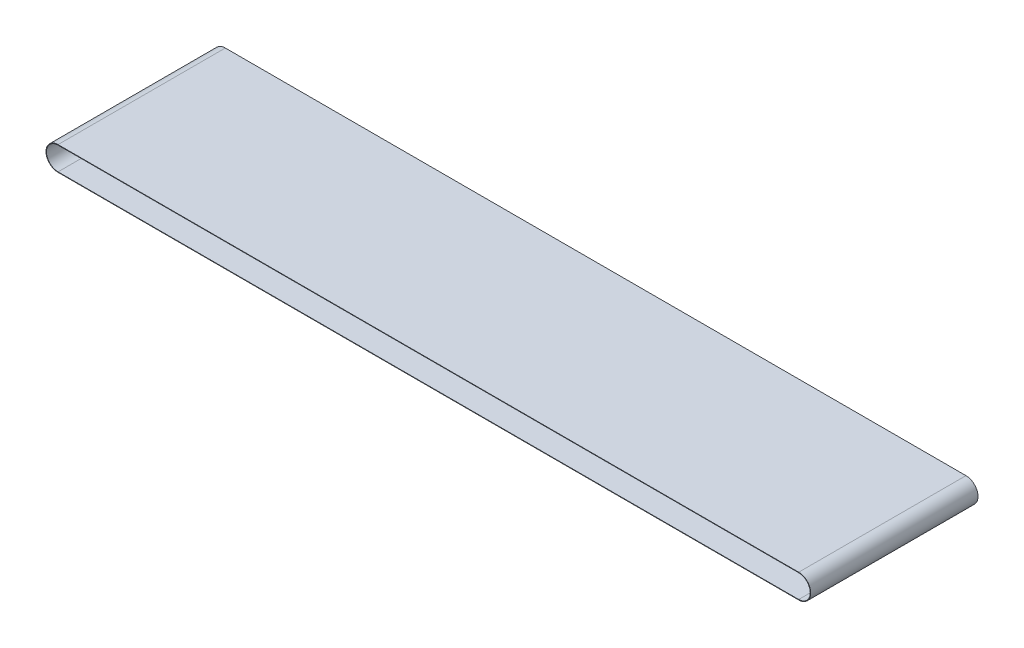
ISO-10303-21;
HEADER;
FILE_DESCRIPTION(('STEP AP214'),'2;1');
FILE_NAME('part.step','',(''),(''),'','','');
FILE_SCHEMA(('AUTOMOTIVE_DESIGN { 1 0 10303 214 1 1 1 1 }'));
ENDSEC;
DATA;
#1=APPLICATION_CONTEXT('core data for automotive mechanical design processes');
#2=APPLICATION_PROTOCOL_DEFINITION('international standard','automotive_design',2000,#1);
#3=PRODUCT_CONTEXT('',#1,'mechanical');
#4=PRODUCT('Part','Part','',(#3));
#5=PRODUCT_RELATED_PRODUCT_CATEGORY('part','',(#4));
#6=PRODUCT_DEFINITION_FORMATION('','',#4);
#7=PRODUCT_DEFINITION_CONTEXT('part definition',#1,'design');
#8=PRODUCT_DEFINITION('design','',#6,#7);
#9=PRODUCT_DEFINITION_SHAPE('','',#8);
#10=(LENGTH_UNIT() NAMED_UNIT(*) SI_UNIT(.MILLI.,.METRE.));
#11=(NAMED_UNIT(*) PLANE_ANGLE_UNIT() SI_UNIT($,.RADIAN.));
#12=(NAMED_UNIT(*) SI_UNIT($,.STERADIAN.) SOLID_ANGLE_UNIT());
#13=UNCERTAINTY_MEASURE_WITH_UNIT(LENGTH_MEASURE(1.E-05),#10,'distance_accuracy_value','');
#14=(GEOMETRIC_REPRESENTATION_CONTEXT(3) GLOBAL_UNCERTAINTY_ASSIGNED_CONTEXT((#13)) GLOBAL_UNIT_ASSIGNED_CONTEXT((#10,
#11,#12)) REPRESENTATION_CONTEXT('',''));
#15=CARTESIAN_POINT('',(0.,0.,0.));
#16=DIRECTION('',(0.,0.,1.));
#17=DIRECTION('',(1.,0.,0.));
#18=AXIS2_PLACEMENT_3D('',#15,#16,#17);
#19=CARTESIAN_POINT('',(0.,0.,1084.));
#20=DIRECTION('',(0.,0.,1.));
#21=DIRECTION('',(1.,0.,0.));
#22=AXIS2_PLACEMENT_3D('',#19,#20,#21);
#23=PLANE('',#22);
#24=CARTESIAN_POINT('',(0.,0.,1084.));
#25=DIRECTION('',(0.,0.,1.));
#26=DIRECTION('',(1.,0.,0.));
#27=AXIS2_PLACEMENT_3D('',#24,#25,#26);
#28=CIRCLE('',#27,78.);
#29=CARTESIAN_POINT('',(0.,78.,1084.));
#30=VERTEX_POINT('',#29);
#31=CARTESIAN_POINT('',(0.,-78.,1084.));
#32=VERTEX_POINT('',#31);
#33=EDGE_CURVE('E162',#30,#32,#28,.T.);
#34=ORIENTED_EDGE('',*,*,#33,.T.);
#35=DIRECTION('',(1.,0.,0.));
#36=VECTOR('',#35,1.);
#37=CARTESIAN_POINT('',(0.,-78.,1084.));
#38=LINE('',#37,#36);
#39=CARTESIAN_POINT('',(4800.,-78.,1084.));
#40=VERTEX_POINT('',#39);
#41=EDGE_CURVE('E167',#32,#40,#38,.T.);
#42=ORIENTED_EDGE('',*,*,#41,.T.);
#43=CARTESIAN_POINT('',(4800.,0.,1084.));
#44=DIRECTION('',(0.,0.,1.));
#45=DIRECTION('',(1.,0.,0.));
#46=AXIS2_PLACEMENT_3D('',#43,#44,#45);
#47=CIRCLE('',#46,78.);
#48=CARTESIAN_POINT('',(4800.,78.,1084.));
#49=VERTEX_POINT('',#48);
#50=EDGE_CURVE('E169',#40,#49,#47,.T.);
#51=ORIENTED_EDGE('',*,*,#50,.T.);
#52=DIRECTION('',(-1.,0.,0.));
#53=VECTOR('',#52,1.);
#54=CARTESIAN_POINT('',(0.,78.,1084.));
#55=LINE('',#54,#53);
#56=EDGE_CURVE('E175',#49,#30,#55,.T.);
#57=ORIENTED_EDGE('',*,*,#56,.T.);
#58=EDGE_LOOP('',(#34,#42,#51,#57));
#59=FACE_BOUND('',#58,.T.);
#60=DIRECTION('',(1.,0.,0.));
#61=VECTOR('',#60,1.);
#62=CARTESIAN_POINT('',(0.,-75.,1084.));
#63=LINE('',#62,#61);
#64=CARTESIAN_POINT('',(0.,-75.,1084.));
#65=VERTEX_POINT('',#64);
#66=CARTESIAN_POINT('',(4800.,-75.,1084.));
#67=VERTEX_POINT('',#66);
#68=EDGE_CURVE('E136',#65,#67,#63,.T.);
#69=ORIENTED_EDGE('',*,*,#68,.F.);
#70=CARTESIAN_POINT('',(0.,0.,1084.));
#71=DIRECTION('',(0.,0.,1.));
#72=DIRECTION('',(1.,0.,0.));
#73=AXIS2_PLACEMENT_3D('',#70,#71,#72);
#74=CIRCLE('',#73,75.);
#75=CARTESIAN_POINT('',(0.,75.,1084.));
#76=VERTEX_POINT('',#75);
#77=EDGE_CURVE('E126',#76,#65,#74,.T.);
#78=ORIENTED_EDGE('',*,*,#77,.F.);
#79=DIRECTION('',(-1.,0.,0.));
#80=VECTOR('',#79,1.);
#81=CARTESIAN_POINT('',(0.,75.,1084.));
#82=LINE('',#81,#80);
#83=CARTESIAN_POINT('',(4800.,75.,1084.));
#84=VERTEX_POINT('',#83);
#85=EDGE_CURVE('E148',#84,#76,#82,.T.);
#86=ORIENTED_EDGE('',*,*,#85,.F.);
#87=CARTESIAN_POINT('',(4800.,0.,1084.));
#88=DIRECTION('',(0.,0.,1.));
#89=DIRECTION('',(1.,0.,0.));
#90=AXIS2_PLACEMENT_3D('',#87,#88,#89);
#91=CIRCLE('',#90,75.);
#92=EDGE_CURVE('E149',#67,#84,#91,.T.);
#93=ORIENTED_EDGE('',*,*,#92,.F.);
#94=EDGE_LOOP('',(#69,#78,#86,#93));
#95=FACE_BOUND('',#94,.T.);
#96=ADVANCED_FACE('F61',(#59,#95),#23,.T.);
#97=CARTESIAN_POINT('',(0.,0.,0.));
#98=DIRECTION('',(0.,0.,1.));
#99=DIRECTION('',(1.,0.,0.));
#100=AXIS2_PLACEMENT_3D('',#97,#98,#99);
#101=PLANE('',#100);
#102=CARTESIAN_POINT('',(0.,0.,0.));
#103=DIRECTION('',(0.,0.,1.));
#104=DIRECTION('',(1.,0.,0.));
#105=AXIS2_PLACEMENT_3D('',#102,#103,#104);
#106=CIRCLE('',#105,78.);
#107=CARTESIAN_POINT('',(0.,78.,0.));
#108=VERTEX_POINT('',#107);
#109=CARTESIAN_POINT('',(0.,-78.,0.));
#110=VERTEX_POINT('',#109);
#111=EDGE_CURVE('E143',#108,#110,#106,.T.);
#112=ORIENTED_EDGE('',*,*,#111,.F.);
#113=DIRECTION('',(-1.,0.,0.));
#114=VECTOR('',#113,1.);
#115=CARTESIAN_POINT('',(0.,78.,0.));
#116=LINE('',#115,#114);
#117=CARTESIAN_POINT('',(4800.,78.,0.));
#118=VERTEX_POINT('',#117);
#119=EDGE_CURVE('E166',#118,#108,#116,.T.);
#120=ORIENTED_EDGE('',*,*,#119,.F.);
#121=CARTESIAN_POINT('',(4800.,0.,0.));
#122=DIRECTION('',(0.,0.,1.));
#123=DIRECTION('',(1.,0.,0.));
#124=AXIS2_PLACEMENT_3D('',#121,#122,#123);
#125=CIRCLE('',#124,78.);
#126=CARTESIAN_POINT('',(4800.,-78.,0.));
#127=VERTEX_POINT('',#126);
#128=EDGE_CURVE('E177',#127,#118,#125,.T.);
#129=ORIENTED_EDGE('',*,*,#128,.F.);
#130=DIRECTION('',(1.,0.,0.));
#131=VECTOR('',#130,1.);
#132=CARTESIAN_POINT('',(0.,-78.,0.));
#133=LINE('',#132,#131);
#134=EDGE_CURVE('E180',#110,#127,#133,.T.);
#135=ORIENTED_EDGE('',*,*,#134,.F.);
#136=EDGE_LOOP('',(#112,#120,#129,#135));
#137=FACE_BOUND('',#136,.T.);
#138=CARTESIAN_POINT('',(0.,0.,0.));
#139=DIRECTION('',(0.,0.,1.));
#140=DIRECTION('',(1.,0.,0.));
#141=AXIS2_PLACEMENT_3D('',#138,#139,#140);
#142=CIRCLE('',#141,75.);
#143=CARTESIAN_POINT('',(0.,75.,0.));
#144=VERTEX_POINT('',#143);
#145=CARTESIAN_POINT('',(0.,-75.,0.));
#146=VERTEX_POINT('',#145);
#147=EDGE_CURVE('E86',#144,#146,#142,.T.);
#148=ORIENTED_EDGE('',*,*,#147,.T.);
#149=DIRECTION('',(1.,0.,0.));
#150=VECTOR('',#149,1.);
#151=CARTESIAN_POINT('',(0.,-75.,0.));
#152=LINE('',#151,#150);
#153=CARTESIAN_POINT('',(4800.,-75.,0.));
#154=VERTEX_POINT('',#153);
#155=EDGE_CURVE('E142',#146,#154,#152,.T.);
#156=ORIENTED_EDGE('',*,*,#155,.T.);
#157=CARTESIAN_POINT('',(4800.,0.,0.));
#158=DIRECTION('',(0.,0.,1.));
#159=DIRECTION('',(1.,0.,0.));
#160=AXIS2_PLACEMENT_3D('',#157,#158,#159);
#161=CIRCLE('',#160,75.);
#162=CARTESIAN_POINT('',(4800.,75.,0.));
#163=VERTEX_POINT('',#162);
#164=EDGE_CURVE('E157',#154,#163,#161,.T.);
#165=ORIENTED_EDGE('',*,*,#164,.T.);
#166=DIRECTION('',(-1.,0.,0.));
#167=VECTOR('',#166,1.);
#168=CARTESIAN_POINT('',(0.,75.,0.));
#169=LINE('',#168,#167);
#170=EDGE_CURVE('E140',#163,#144,#169,.T.);
#171=ORIENTED_EDGE('',*,*,#170,.T.);
#172=EDGE_LOOP('',(#148,#156,#165,#171));
#173=FACE_BOUND('',#172,.T.);
#174=ADVANCED_FACE('F200',(#137,#173),#101,.F.);
#175=CARTESIAN_POINT('',(0.,0.,1084.));
#176=DIRECTION('',(0.,0.,-1.));
#177=DIRECTION('',(-1.,0.,0.));
#178=AXIS2_PLACEMENT_3D('',#175,#176,#177);
#179=CYLINDRICAL_SURFACE('',#178,78.);
#180=ORIENTED_EDGE('',*,*,#111,.T.);
#181=DIRECTION('',(0.,0.,-1.));
#182=VECTOR('',#181,1.);
#183=CARTESIAN_POINT('',(0.,-78.,1084.));
#184=LINE('',#183,#182);
#185=EDGE_CURVE('E12',#32,#110,#184,.T.);
#186=ORIENTED_EDGE('',*,*,#185,.F.);
#187=ORIENTED_EDGE('',*,*,#33,.F.);
#188=DIRECTION('',(0.,0.,-1.));
#189=VECTOR('',#188,1.);
#190=CARTESIAN_POINT('',(0.,78.,1084.));
#191=LINE('',#190,#189);
#192=EDGE_CURVE('E174',#30,#108,#191,.T.);
#193=ORIENTED_EDGE('',*,*,#192,.T.);
#194=EDGE_LOOP('',(#180,#186,#187,#193));
#195=FACE_BOUND('',#194,.T.);
#196=ADVANCED_FACE('F64',(#195),#179,.T.);
#197=CARTESIAN_POINT('',(0.,-78.,1084.));
#198=DIRECTION('',(0.,1.,0.));
#199=DIRECTION('',(-1.,0.,0.));
#200=AXIS2_PLACEMENT_3D('',#197,#198,#199);
#201=PLANE('',#200);
#202=ORIENTED_EDGE('',*,*,#134,.T.);
#203=DIRECTION('',(0.,0.,-1.));
#204=VECTOR('',#203,1.);
#205=CARTESIAN_POINT('',(4800.,-78.,1084.));
#206=LINE('',#205,#204);
#207=EDGE_CURVE('E73',#40,#127,#206,.T.);
#208=ORIENTED_EDGE('',*,*,#207,.F.);
#209=ORIENTED_EDGE('',*,*,#41,.F.);
#210=ORIENTED_EDGE('',*,*,#185,.T.);
#211=EDGE_LOOP('',(#202,#208,#209,#210));
#212=FACE_BOUND('',#211,.T.);
#213=ADVANCED_FACE('F210',(#212),#201,.F.);
#214=CARTESIAN_POINT('',(4800.,0.,1084.));
#215=DIRECTION('',(0.,0.,-1.));
#216=DIRECTION('',(-1.,0.,0.));
#217=AXIS2_PLACEMENT_3D('',#214,#215,#216);
#218=CYLINDRICAL_SURFACE('',#217,78.);
#219=ORIENTED_EDGE('',*,*,#128,.T.);
#220=DIRECTION('',(0.,0.,-1.));
#221=VECTOR('',#220,1.);
#222=CARTESIAN_POINT('',(4800.,78.,1084.));
#223=LINE('',#222,#221);
#224=EDGE_CURVE('E182',#49,#118,#223,.T.);
#225=ORIENTED_EDGE('',*,*,#224,.F.);
#226=ORIENTED_EDGE('',*,*,#50,.F.);
#227=ORIENTED_EDGE('',*,*,#207,.T.);
#228=EDGE_LOOP('',(#219,#225,#226,#227));
#229=FACE_BOUND('',#228,.T.);
#230=ADVANCED_FACE('F192',(#229),#218,.T.);
#231=CARTESIAN_POINT('',(0.,78.,1084.));
#232=DIRECTION('',(0.,-1.,0.));
#233=DIRECTION('',(1.,0.,0.));
#234=AXIS2_PLACEMENT_3D('',#231,#232,#233);
#235=PLANE('',#234);
#236=ORIENTED_EDGE('',*,*,#119,.T.);
#237=ORIENTED_EDGE('',*,*,#192,.F.);
#238=ORIENTED_EDGE('',*,*,#56,.F.);
#239=ORIENTED_EDGE('',*,*,#224,.T.);
#240=EDGE_LOOP('',(#236,#237,#238,#239));
#241=FACE_BOUND('',#240,.T.);
#242=ADVANCED_FACE('F202',(#241),#235,.F.);
#243=CARTESIAN_POINT('',(0.,0.,1084.));
#244=DIRECTION('',(0.,0.,-1.));
#245=DIRECTION('',(-1.,0.,0.));
#246=AXIS2_PLACEMENT_3D('',#243,#244,#245);
#247=CYLINDRICAL_SURFACE('',#246,75.);
#248=ORIENTED_EDGE('',*,*,#147,.F.);
#249=DIRECTION('',(0.,0.,-1.));
#250=VECTOR('',#249,1.);
#251=CARTESIAN_POINT('',(0.,75.,1084.));
#252=LINE('',#251,#250);
#253=EDGE_CURVE('E135',#76,#144,#252,.T.);
#254=ORIENTED_EDGE('',*,*,#253,.F.);
#255=ORIENTED_EDGE('',*,*,#77,.T.);
#256=DIRECTION('',(0.,0.,-1.));
#257=VECTOR('',#256,1.);
#258=CARTESIAN_POINT('',(0.,-75.,1084.));
#259=LINE('',#258,#257);
#260=EDGE_CURVE('E131',#65,#146,#259,.T.);
#261=ORIENTED_EDGE('',*,*,#260,.T.);
#262=EDGE_LOOP('',(#248,#254,#255,#261));
#263=FACE_BOUND('',#262,.T.);
#264=ADVANCED_FACE('F127',(#263),#247,.F.);
#265=CARTESIAN_POINT('',(0.,-75.,1084.));
#266=DIRECTION('',(0.,1.,0.));
#267=DIRECTION('',(-1.,0.,0.));
#268=AXIS2_PLACEMENT_3D('',#265,#266,#267);
#269=PLANE('',#268);
#270=ORIENTED_EDGE('',*,*,#155,.F.);
#271=ORIENTED_EDGE('',*,*,#260,.F.);
#272=ORIENTED_EDGE('',*,*,#68,.T.);
#273=DIRECTION('',(0.,0.,-1.));
#274=VECTOR('',#273,1.);
#275=CARTESIAN_POINT('',(4800.,-75.,1084.));
#276=LINE('',#275,#274);
#277=EDGE_CURVE('E144',#67,#154,#276,.T.);
#278=ORIENTED_EDGE('',*,*,#277,.T.);
#279=EDGE_LOOP('',(#270,#271,#272,#278));
#280=FACE_BOUND('',#279,.T.);
#281=ADVANCED_FACE('F139',(#280),#269,.T.);
#282=CARTESIAN_POINT('',(4800.,0.,1084.));
#283=DIRECTION('',(0.,0.,-1.));
#284=DIRECTION('',(-1.,0.,0.));
#285=AXIS2_PLACEMENT_3D('',#282,#283,#284);
#286=CYLINDRICAL_SURFACE('',#285,75.);
#287=ORIENTED_EDGE('',*,*,#164,.F.);
#288=ORIENTED_EDGE('',*,*,#277,.F.);
#289=ORIENTED_EDGE('',*,*,#92,.T.);
#290=DIRECTION('',(0.,0.,-1.));
#291=VECTOR('',#290,1.);
#292=CARTESIAN_POINT('',(4800.,75.,1084.));
#293=LINE('',#292,#291);
#294=EDGE_CURVE('E76',#84,#163,#293,.T.);
#295=ORIENTED_EDGE('',*,*,#294,.T.);
#296=EDGE_LOOP('',(#287,#288,#289,#295));
#297=FACE_BOUND('',#296,.T.);
#298=ADVANCED_FACE('F229',(#297),#286,.F.);
#299=CARTESIAN_POINT('',(0.,75.,1084.));
#300=DIRECTION('',(0.,-1.,0.));
#301=DIRECTION('',(1.,0.,0.));
#302=AXIS2_PLACEMENT_3D('',#299,#300,#301);
#303=PLANE('',#302);
#304=ORIENTED_EDGE('',*,*,#170,.F.);
#305=ORIENTED_EDGE('',*,*,#294,.F.);
#306=ORIENTED_EDGE('',*,*,#85,.T.);
#307=ORIENTED_EDGE('',*,*,#253,.T.);
#308=EDGE_LOOP('',(#304,#305,#306,#307));
#309=FACE_BOUND('',#308,.T.);
#310=ADVANCED_FACE('F233',(#309),#303,.T.);
#311=CLOSED_SHELL('',(#96,#174,#196,#213,#230,#242,#264,#281,#298,#310));
#312=MANIFOLD_SOLID_BREP('B2',#311);
#313=ADVANCED_BREP_SHAPE_REPRESENTATION('',(#18,#312),#14);
#314=SHAPE_DEFINITION_REPRESENTATION(#9,#313);
ENDSEC;
END-ISO-10303-21;
